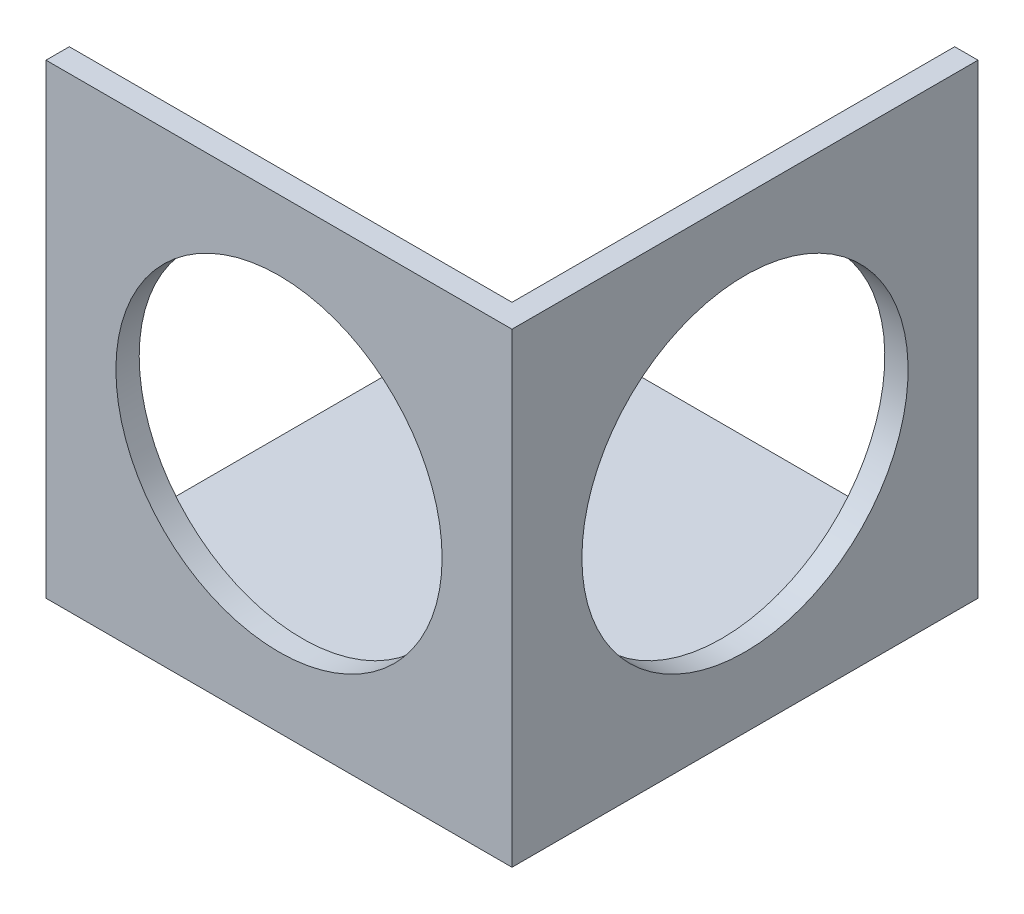
ISO-10303-21;
HEADER;
FILE_DESCRIPTION(('STEP AP214'),'2;1');
FILE_NAME('part.step','',(''),(''),'','','');
FILE_SCHEMA(('AUTOMOTIVE_DESIGN { 1 0 10303 214 1 1 1 1 }'));
ENDSEC;
DATA;
#1=APPLICATION_CONTEXT('core data for automotive mechanical design processes');
#2=APPLICATION_PROTOCOL_DEFINITION('international standard','automotive_design',2000,#1);
#3=PRODUCT_CONTEXT('',#1,'mechanical');
#4=PRODUCT('Part','Part','',(#3));
#5=PRODUCT_RELATED_PRODUCT_CATEGORY('part','',(#4));
#6=PRODUCT_DEFINITION_FORMATION('','',#4);
#7=PRODUCT_DEFINITION_CONTEXT('part definition',#1,'design');
#8=PRODUCT_DEFINITION('design','',#6,#7);
#9=PRODUCT_DEFINITION_SHAPE('','',#8);
#10=(LENGTH_UNIT() NAMED_UNIT(*) SI_UNIT(.MILLI.,.METRE.));
#11=(NAMED_UNIT(*) PLANE_ANGLE_UNIT() SI_UNIT($,.RADIAN.));
#12=(NAMED_UNIT(*) SI_UNIT($,.STERADIAN.) SOLID_ANGLE_UNIT());
#13=UNCERTAINTY_MEASURE_WITH_UNIT(LENGTH_MEASURE(1.E-05),#10,'distance_accuracy_value','');
#14=(GEOMETRIC_REPRESENTATION_CONTEXT(3) GLOBAL_UNCERTAINTY_ASSIGNED_CONTEXT((#13)) GLOBAL_UNIT_ASSIGNED_CONTEXT((#10,
#11,#12)) REPRESENTATION_CONTEXT('',''));
#15=CARTESIAN_POINT('',(0.,0.,0.));
#16=DIRECTION('',(0.,0.,1.));
#17=DIRECTION('',(1.,0.,0.));
#18=AXIS2_PLACEMENT_3D('',#15,#16,#17);
#19=CARTESIAN_POINT('',(46.5641998222067,41.1981284939259,100.));
#20=DIRECTION('',(-1.,0.,0.));
#21=DIRECTION('',(0.,-1.,0.));
#22=AXIS2_PLACEMENT_3D('',#19,#20,#21);
#23=PLANE('',#22);
#24=CARTESIAN_POINT('',(46.5641998222067,-3.80176171329898,50.));
#25=DIRECTION('',(-1.,0.,0.));
#26=DIRECTION('',(0.,-1.,0.));
#27=AXIS2_PLACEMENT_3D('',#24,#25,#26);
#28=CIRCLE('',#27,35.);
#29=CARTESIAN_POINT('',(46.5641998222067,-38.801761713299,50.));
#30=VERTEX_POINT('',#29);
#31=EDGE_CURVE('E278',#30,#30,#28,.T.);
#32=ORIENTED_EDGE('',*,*,#31,.F.);
#33=EDGE_LOOP('',(#32));
#34=FACE_BOUND('',#33,.T.);
#35=DIRECTION('',(0.,0.,-1.));
#36=VECTOR('',#35,1.);
#37=CARTESIAN_POINT('',(46.5641998222067,-48.8016519205239,95.));
#38=LINE('',#37,#36);
#39=CARTESIAN_POINT('',(46.5641998222067,-48.8016519205239,95.));
#40=VERTEX_POINT('',#39);
#41=CARTESIAN_POINT('',(46.5641998222067,-48.8016519205238,0.));
#42=VERTEX_POINT('',#41);
#43=EDGE_CURVE('E108',#40,#42,#38,.T.);
#44=ORIENTED_EDGE('',*,*,#43,.F.);
#45=DIRECTION('',(0.,-1.,0.));
#46=VECTOR('',#45,1.);
#47=CARTESIAN_POINT('',(46.5641998222067,46.1981284939259,95.));
#48=LINE('',#47,#46);
#49=CARTESIAN_POINT('',(46.5641998222067,46.1981284939259,95.));
#50=VERTEX_POINT('',#49);
#51=EDGE_CURVE('E113',#50,#40,#48,.T.);
#52=ORIENTED_EDGE('',*,*,#51,.F.);
#53=DIRECTION('',(0.,0.,-1.));
#54=VECTOR('',#53,1.);
#55=CARTESIAN_POINT('',(46.5641998222067,46.1981284939259,95.));
#56=LINE('',#55,#54);
#57=CARTESIAN_POINT('',(46.5641998222067,46.1981284939259,0.));
#58=VERTEX_POINT('',#57);
#59=EDGE_CURVE('E122',#50,#58,#56,.T.);
#60=ORIENTED_EDGE('',*,*,#59,.T.);
#61=DIRECTION('',(0.,1.,0.));
#62=VECTOR('',#61,1.);
#63=CARTESIAN_POINT('',(46.5641998222067,41.1981284939259,0.));
#64=LINE('',#63,#62);
#65=EDGE_CURVE('E48',#42,#58,#64,.T.);
#66=ORIENTED_EDGE('',*,*,#65,.F.);
#67=EDGE_LOOP('',(#44,#52,#60,#66));
#68=FACE_BOUND('',#67,.T.);
#69=ADVANCED_FACE('F32',(#34,#68),#23,.T.);
#70=CARTESIAN_POINT('',(0.,0.,100.));
#71=DIRECTION('',(0.,0.,1.));
#72=DIRECTION('',(1.,0.,0.));
#73=AXIS2_PLACEMENT_3D('',#70,#71,#72);
#74=PLANE('',#73);
#75=CARTESIAN_POINT('',(1.56419982220674,-3.80176171329897,100.));
#76=DIRECTION('',(0.,0.,1.));
#77=DIRECTION('',(1.,0.,0.));
#78=AXIS2_PLACEMENT_3D('',#75,#76,#77);
#79=CIRCLE('',#78,35.);
#80=CARTESIAN_POINT('',(36.5641998222067,-3.80176171329897,100.));
#81=VERTEX_POINT('',#80);
#82=EDGE_CURVE('E273',#81,#81,#79,.T.);
#83=ORIENTED_EDGE('',*,*,#82,.F.);
#84=EDGE_LOOP('',(#83));
#85=FACE_BOUND('',#84,.T.);
#86=DIRECTION('',(0.,-1.,0.));
#87=VECTOR('',#86,1.);
#88=CARTESIAN_POINT('',(-48.4358001777933,46.1981284939259,100.));
#89=LINE('',#88,#87);
#90=CARTESIAN_POINT('',(-48.4358001777933,46.1981284939259,100.));
#91=VERTEX_POINT('',#90);
#92=CARTESIAN_POINT('',(-48.4358001777933,-53.8018715060741,100.));
#93=VERTEX_POINT('',#92);
#94=EDGE_CURVE('E125',#91,#93,#89,.T.);
#95=ORIENTED_EDGE('',*,*,#94,.T.);
#96=DIRECTION('',(1.,0.,0.));
#97=VECTOR('',#96,1.);
#98=CARTESIAN_POINT('',(-48.4358001777933,-53.8018715060741,100.));
#99=LINE('',#98,#97);
#100=CARTESIAN_POINT('',(51.5641998222067,-53.8018715060741,100.));
#101=VERTEX_POINT('',#100);
#102=EDGE_CURVE('E128',#93,#101,#99,.T.);
#103=ORIENTED_EDGE('',*,*,#102,.T.);
#104=DIRECTION('',(0.,1.,0.));
#105=VECTOR('',#104,1.);
#106=CARTESIAN_POINT('',(51.5641998222067,46.1981284939259,100.));
#107=LINE('',#106,#105);
#108=CARTESIAN_POINT('',(51.5641998222067,46.1981284939259,100.));
#109=VERTEX_POINT('',#108);
#110=EDGE_CURVE('E131',#101,#109,#107,.T.);
#111=ORIENTED_EDGE('',*,*,#110,.T.);
#112=DIRECTION('',(-1.,0.,0.));
#113=VECTOR('',#112,1.);
#114=CARTESIAN_POINT('',(-48.4358001777933,46.1981284939259,100.));
#115=LINE('',#114,#113);
#116=EDGE_CURVE('E133',#109,#91,#115,.T.);
#117=ORIENTED_EDGE('',*,*,#116,.T.);
#118=EDGE_LOOP('',(#95,#103,#111,#117));
#119=FACE_BOUND('',#118,.T.);
#120=ADVANCED_FACE('F161',(#85,#119),#74,.T.);
#121=CARTESIAN_POINT('',(0.,0.,0.));
#122=DIRECTION('',(0.,0.,1.));
#123=DIRECTION('',(1.,0.,0.));
#124=AXIS2_PLACEMENT_3D('',#121,#122,#123);
#125=PLANE('',#124);
#126=DIRECTION('',(-1.,0.,0.));
#127=VECTOR('',#126,1.);
#128=CARTESIAN_POINT('',(46.5641998222067,-48.8016519205239,0.));
#129=LINE('',#128,#127);
#130=CARTESIAN_POINT('',(-48.4358001777933,-48.8016519205239,0.));
#131=VERTEX_POINT('',#130);
#132=EDGE_CURVE('E95',#42,#131,#129,.T.);
#133=ORIENTED_EDGE('',*,*,#132,.F.);
#134=ORIENTED_EDGE('',*,*,#65,.T.);
#135=DIRECTION('',(-1.,0.,0.));
#136=VECTOR('',#135,1.);
#137=CARTESIAN_POINT('',(-48.4358001777933,46.1981284939259,0.));
#138=LINE('',#137,#136);
#139=CARTESIAN_POINT('',(51.5641998222067,46.1981284939259,0.));
#140=VERTEX_POINT('',#139);
#141=EDGE_CURVE('E129',#140,#58,#138,.T.);
#142=ORIENTED_EDGE('',*,*,#141,.F.);
#143=DIRECTION('',(0.,1.,0.));
#144=VECTOR('',#143,1.);
#145=CARTESIAN_POINT('',(51.5641998222067,46.1981284939259,0.));
#146=LINE('',#145,#144);
#147=CARTESIAN_POINT('',(51.5641998222067,-53.8018715060741,0.));
#148=VERTEX_POINT('',#147);
#149=EDGE_CURVE('E137',#148,#140,#146,.T.);
#150=ORIENTED_EDGE('',*,*,#149,.F.);
#151=DIRECTION('',(1.,0.,0.));
#152=VECTOR('',#151,1.);
#153=CARTESIAN_POINT('',(-48.4358001777933,-53.8018715060741,0.));
#154=LINE('',#153,#152);
#155=CARTESIAN_POINT('',(-48.4358001777933,-53.8018715060741,0.));
#156=VERTEX_POINT('',#155);
#157=EDGE_CURVE('E99',#156,#148,#154,.T.);
#158=ORIENTED_EDGE('',*,*,#157,.F.);
#159=DIRECTION('',(0.,-1.,0.));
#160=VECTOR('',#159,1.);
#161=CARTESIAN_POINT('',(-48.4358001777933,46.1981284939259,0.));
#162=LINE('',#161,#160);
#163=EDGE_CURVE('E92',#131,#156,#162,.T.);
#164=ORIENTED_EDGE('',*,*,#163,.F.);
#165=EDGE_LOOP('',(#133,#134,#142,#150,#158,#164));
#166=FACE_BOUND('',#165,.T.);
#167=ADVANCED_FACE('F94',(#166),#125,.F.);
#168=CARTESIAN_POINT('',(-48.4358001777933,46.1981284939259,100.));
#169=DIRECTION('',(1.,0.,0.));
#170=DIRECTION('',(0.,1.,0.));
#171=AXIS2_PLACEMENT_3D('',#168,#169,#170);
#172=PLANE('',#171);
#173=DIRECTION('',(0.,1.,0.));
#174=VECTOR('',#173,1.);
#175=CARTESIAN_POINT('',(-48.4358001777933,46.1981284939259,95.));
#176=LINE('',#175,#174);
#177=CARTESIAN_POINT('',(-48.4358001777933,-48.8016519205239,95.));
#178=VERTEX_POINT('',#177);
#179=CARTESIAN_POINT('',(-48.4358001777933,46.1981284939259,95.));
#180=VERTEX_POINT('',#179);
#181=EDGE_CURVE('E111',#178,#180,#176,.T.);
#182=ORIENTED_EDGE('',*,*,#181,.F.);
#183=DIRECTION('',(0.,0.,1.));
#184=VECTOR('',#183,1.);
#185=CARTESIAN_POINT('',(-48.4358001777933,-48.8016519205239,95.));
#186=LINE('',#185,#184);
#187=EDGE_CURVE('E107',#131,#178,#186,.T.);
#188=ORIENTED_EDGE('',*,*,#187,.F.);
#189=ORIENTED_EDGE('',*,*,#163,.T.);
#190=DIRECTION('',(0.,0.,-1.));
#191=VECTOR('',#190,1.);
#192=CARTESIAN_POINT('',(-48.4358001777933,-53.8018715060741,100.));
#193=LINE('',#192,#191);
#194=EDGE_CURVE('E11',#93,#156,#193,.T.);
#195=ORIENTED_EDGE('',*,*,#194,.F.);
#196=ORIENTED_EDGE('',*,*,#94,.F.);
#197=DIRECTION('',(0.,0.,-1.));
#198=VECTOR('',#197,1.);
#199=CARTESIAN_POINT('',(-48.4358001777933,46.1981284939259,100.));
#200=LINE('',#199,#198);
#201=EDGE_CURVE('E134',#91,#180,#200,.T.);
#202=ORIENTED_EDGE('',*,*,#201,.T.);
#203=EDGE_LOOP('',(#182,#188,#189,#195,#196,#202));
#204=FACE_BOUND('',#203,.T.);
#205=ADVANCED_FACE('F34',(#204),#172,.F.);
#206=CARTESIAN_POINT('',(-48.4358001777933,-53.8018715060741,100.));
#207=DIRECTION('',(0.,1.,0.));
#208=DIRECTION('',(0.,0.,1.));
#209=AXIS2_PLACEMENT_3D('',#206,#207,#208);
#210=PLANE('',#209);
#211=ORIENTED_EDGE('',*,*,#194,.T.);
#212=ORIENTED_EDGE('',*,*,#157,.T.);
#213=DIRECTION('',(0.,0.,-1.));
#214=VECTOR('',#213,1.);
#215=CARTESIAN_POINT('',(51.5641998222067,-53.8018715060741,100.));
#216=LINE('',#215,#214);
#217=EDGE_CURVE('E41',#101,#148,#216,.T.);
#218=ORIENTED_EDGE('',*,*,#217,.F.);
#219=ORIENTED_EDGE('',*,*,#102,.F.);
#220=EDGE_LOOP('',(#211,#212,#218,#219));
#221=FACE_BOUND('',#220,.T.);
#222=ADVANCED_FACE('F152',(#221),#210,.F.);
#223=CARTESIAN_POINT('',(51.5641998222067,46.1981284939259,100.));
#224=DIRECTION('',(-1.,0.,0.));
#225=DIRECTION('',(0.,0.,1.));
#226=AXIS2_PLACEMENT_3D('',#223,#224,#225);
#227=PLANE('',#226);
#228=CARTESIAN_POINT('',(51.5641998222067,-3.80176171329897,50.));
#229=DIRECTION('',(-1.,0.,0.));
#230=DIRECTION('',(0.,0.,1.));
#231=AXIS2_PLACEMENT_3D('',#228,#229,#230);
#232=CIRCLE('',#231,35.);
#233=CARTESIAN_POINT('',(51.5641998222067,-3.80176171329897,85.));
#234=VERTEX_POINT('',#233);
#235=EDGE_CURVE('E36',#234,#234,#232,.T.);
#236=ORIENTED_EDGE('',*,*,#235,.T.);
#237=EDGE_LOOP('',(#236));
#238=FACE_BOUND('',#237,.T.);
#239=ORIENTED_EDGE('',*,*,#217,.T.);
#240=ORIENTED_EDGE('',*,*,#149,.T.);
#241=DIRECTION('',(0.,0.,-1.));
#242=VECTOR('',#241,1.);
#243=CARTESIAN_POINT('',(51.5641998222067,46.1981284939259,100.));
#244=LINE('',#243,#242);
#245=EDGE_CURVE('E143',#109,#140,#244,.T.);
#246=ORIENTED_EDGE('',*,*,#245,.F.);
#247=ORIENTED_EDGE('',*,*,#110,.F.);
#248=EDGE_LOOP('',(#239,#240,#246,#247));
#249=FACE_BOUND('',#248,.T.);
#250=ADVANCED_FACE('F148',(#238,#249),#227,.F.);
#251=CARTESIAN_POINT('',(-48.4358001777933,46.1981284939259,100.));
#252=DIRECTION('',(0.,-1.,0.));
#253=DIRECTION('',(0.,0.,-1.));
#254=AXIS2_PLACEMENT_3D('',#251,#252,#253);
#255=PLANE('',#254);
#256=ORIENTED_EDGE('',*,*,#141,.T.);
#257=ORIENTED_EDGE('',*,*,#59,.F.);
#258=DIRECTION('',(1.,0.,0.));
#259=VECTOR('',#258,1.);
#260=CARTESIAN_POINT('',(46.5641998222067,46.1981284939259,95.));
#261=LINE('',#260,#259);
#262=EDGE_CURVE('E119',#180,#50,#261,.T.);
#263=ORIENTED_EDGE('',*,*,#262,.F.);
#264=ORIENTED_EDGE('',*,*,#201,.F.);
#265=ORIENTED_EDGE('',*,*,#116,.F.);
#266=ORIENTED_EDGE('',*,*,#245,.T.);
#267=EDGE_LOOP('',(#256,#257,#263,#264,#265,#266));
#268=FACE_BOUND('',#267,.T.);
#269=ADVANCED_FACE('F155',(#268),#255,.F.);
#270=CARTESIAN_POINT('',(0.,0.,95.));
#271=DIRECTION('',(0.,0.,-1.));
#272=DIRECTION('',(-1.,0.,0.));
#273=AXIS2_PLACEMENT_3D('',#270,#271,#272);
#274=PLANE('',#273);
#275=CARTESIAN_POINT('',(1.56419982220674,-3.80176171329897,95.));
#276=DIRECTION('',(0.,0.,-1.));
#277=DIRECTION('',(-1.,0.,0.));
#278=AXIS2_PLACEMENT_3D('',#275,#276,#277);
#279=CIRCLE('',#278,35.);
#280=CARTESIAN_POINT('',(-33.4358001777933,-3.80176171329897,95.));
#281=VERTEX_POINT('',#280);
#282=EDGE_CURVE('E271',#281,#281,#279,.T.);
#283=ORIENTED_EDGE('',*,*,#282,.F.);
#284=EDGE_LOOP('',(#283));
#285=FACE_BOUND('',#284,.T.);
#286=DIRECTION('',(1.,0.,0.));
#287=VECTOR('',#286,1.);
#288=CARTESIAN_POINT('',(46.5641998222067,-48.8016519205239,95.));
#289=LINE('',#288,#287);
#290=EDGE_CURVE('E56',#178,#40,#289,.T.);
#291=ORIENTED_EDGE('',*,*,#290,.F.);
#292=ORIENTED_EDGE('',*,*,#181,.T.);
#293=ORIENTED_EDGE('',*,*,#262,.T.);
#294=ORIENTED_EDGE('',*,*,#51,.T.);
#295=EDGE_LOOP('',(#291,#292,#293,#294));
#296=FACE_BOUND('',#295,.T.);
#297=ADVANCED_FACE('F177',(#285,#296),#274,.T.);
#298=CARTESIAN_POINT('',(0.,-48.8016519205239,0.));
#299=DIRECTION('',(0.,1.,0.));
#300=DIRECTION('',(0.,0.,1.));
#301=AXIS2_PLACEMENT_3D('',#298,#299,#300);
#302=PLANE('',#301);
#303=ORIENTED_EDGE('',*,*,#43,.T.);
#304=ORIENTED_EDGE('',*,*,#132,.T.);
#305=ORIENTED_EDGE('',*,*,#187,.T.);
#306=ORIENTED_EDGE('',*,*,#290,.T.);
#307=EDGE_LOOP('',(#303,#304,#305,#306));
#308=FACE_BOUND('',#307,.T.);
#309=ADVANCED_FACE('F106',(#308),#302,.T.);
#310=CARTESIAN_POINT('',(1.56419982220674,-3.80176171329897,150.5));
#311=DIRECTION('',(0.,0.,-1.));
#312=DIRECTION('',(-1.,0.,0.));
#313=AXIS2_PLACEMENT_3D('',#310,#311,#312);
#314=CYLINDRICAL_SURFACE('',#313,35.);
#315=ORIENTED_EDGE('',*,*,#82,.T.);
#316=EDGE_LOOP('',(#315));
#317=FACE_BOUND('',#316,.T.);
#318=ORIENTED_EDGE('',*,*,#282,.T.);
#319=EDGE_LOOP('',(#318));
#320=FACE_BOUND('',#319,.T.);
#321=ADVANCED_FACE('F227',(#317,#320),#314,.F.);
#322=CARTESIAN_POINT('',(68.0641998222068,-3.80176171329897,50.));
#323=DIRECTION('',(-1.,0.,0.));
#324=DIRECTION('',(0.,-1.,0.));
#325=AXIS2_PLACEMENT_3D('',#322,#323,#324);
#326=CYLINDRICAL_SURFACE('',#325,35.);
#327=ORIENTED_EDGE('',*,*,#31,.T.);
#328=EDGE_LOOP('',(#327));
#329=FACE_BOUND('',#328,.T.);
#330=ORIENTED_EDGE('',*,*,#235,.F.);
#331=EDGE_LOOP('',(#330));
#332=FACE_BOUND('',#331,.T.);
#333=ADVANCED_FACE('F223',(#329,#332),#326,.F.);
#334=CLOSED_SHELL('',(#69,#120,#167,#205,#222,#250,#269,#297,#309,#321,#333));
#335=MANIFOLD_SOLID_BREP('B2',#334);
#336=ADVANCED_BREP_SHAPE_REPRESENTATION('',(#18,#335),#14);
#337=SHAPE_DEFINITION_REPRESENTATION(#9,#336);
ENDSEC;
END-ISO-10303-21;
